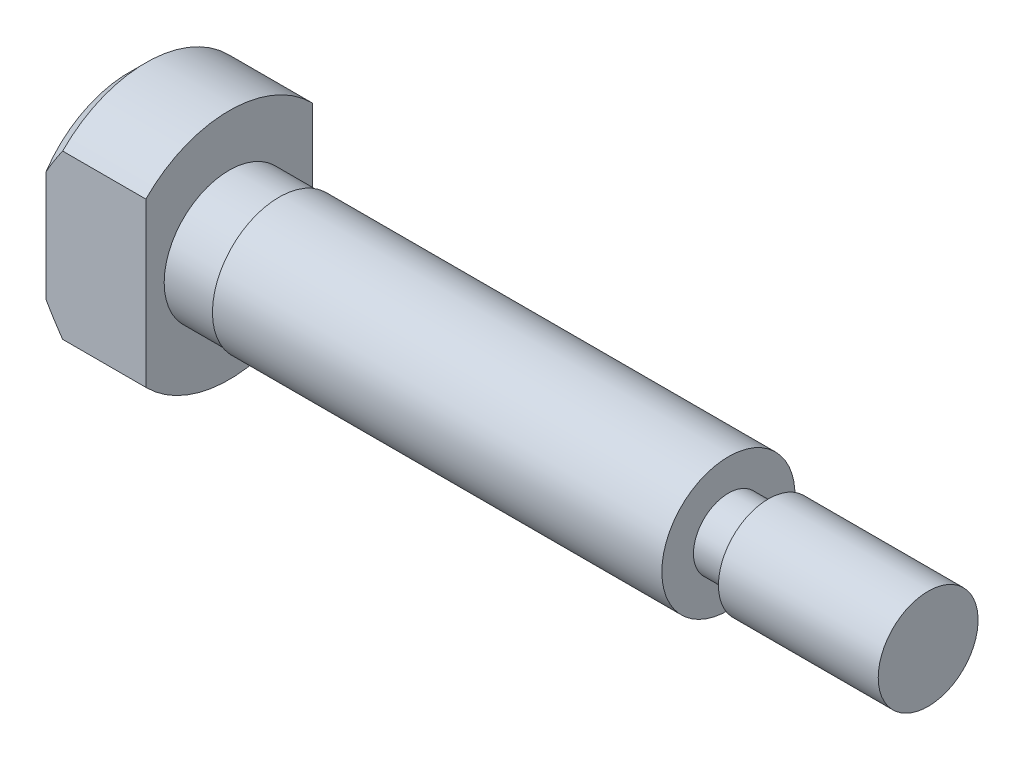
ISO-10303-21;
HEADER;
FILE_DESCRIPTION(('STEP AP214'),'2;1');
FILE_NAME('part.step','',(''),(''),'','','');
FILE_SCHEMA(('AUTOMOTIVE_DESIGN { 1 0 10303 214 1 1 1 1 }'));
ENDSEC;
DATA;
#1=APPLICATION_CONTEXT('core data for automotive mechanical design processes');
#2=APPLICATION_PROTOCOL_DEFINITION('international standard','automotive_design',2000,#1);
#3=PRODUCT_CONTEXT('',#1,'mechanical');
#4=PRODUCT('Part','Part','',(#3));
#5=PRODUCT_RELATED_PRODUCT_CATEGORY('part','',(#4));
#6=PRODUCT_DEFINITION_FORMATION('','',#4);
#7=PRODUCT_DEFINITION_CONTEXT('part definition',#1,'design');
#8=PRODUCT_DEFINITION('design','',#6,#7);
#9=PRODUCT_DEFINITION_SHAPE('','',#8);
#10=(LENGTH_UNIT() NAMED_UNIT(*) SI_UNIT(.MILLI.,.METRE.));
#11=(NAMED_UNIT(*) PLANE_ANGLE_UNIT() SI_UNIT($,.RADIAN.));
#12=(NAMED_UNIT(*) SI_UNIT($,.STERADIAN.) SOLID_ANGLE_UNIT());
#13=UNCERTAINTY_MEASURE_WITH_UNIT(LENGTH_MEASURE(1.E-05),#10,'distance_accuracy_value','');
#14=(GEOMETRIC_REPRESENTATION_CONTEXT(3) GLOBAL_UNCERTAINTY_ASSIGNED_CONTEXT((#13)) GLOBAL_UNIT_ASSIGNED_CONTEXT((#10,
#11,#12)) REPRESENTATION_CONTEXT('',''));
#15=CARTESIAN_POINT('',(0.,0.,0.));
#16=DIRECTION('',(0.,0.,1.));
#17=DIRECTION('',(1.,0.,0.));
#18=AXIS2_PLACEMENT_3D('',#15,#16,#17);
#19=CARTESIAN_POINT('',(0.,0.,0.));
#20=DIRECTION('',(-1.,0.,0.));
#21=DIRECTION('',(0.,0.,1.));
#22=AXIS2_PLACEMENT_3D('',#19,#20,#21);
#23=CYLINDRICAL_SURFACE('',#22,3.5);
#24=DIRECTION('',(-1.,0.,0.));
#25=VECTOR('',#24,1.);
#26=CARTESIAN_POINT('',(0.,2.44948974278318,-2.5));
#27=LINE('',#26,#25);
#28=CARTESIAN_POINT('',(0.,2.44948974278318,-2.5));
#29=VERTEX_POINT('',#28);
#30=CARTESIAN_POINT('',(-2.5,2.44948974278318,-2.5));
#31=VERTEX_POINT('',#30);
#32=EDGE_CURVE('E297',#29,#31,#27,.T.);
#33=ORIENTED_EDGE('',*,*,#32,.T.);
#34=CARTESIAN_POINT('',(-2.5,0.,0.));
#35=DIRECTION('',(1.,0.,0.));
#36=DIRECTION('',(0.,0.,-1.));
#37=AXIS2_PLACEMENT_3D('',#34,#35,#36);
#38=CIRCLE('',#37,3.5);
#39=CARTESIAN_POINT('',(-2.5,2.44948974278318,2.5));
#40=VERTEX_POINT('',#39);
#41=EDGE_CURVE('E11',#31,#40,#38,.T.);
#42=ORIENTED_EDGE('',*,*,#41,.T.);
#43=DIRECTION('',(-1.,0.,0.));
#44=VECTOR('',#43,1.);
#45=CARTESIAN_POINT('',(0.,2.44948974278318,2.5));
#46=LINE('',#45,#44);
#47=CARTESIAN_POINT('',(0.,2.44948974278318,2.5));
#48=VERTEX_POINT('',#47);
#49=EDGE_CURVE('E89',#40,#48,#46,.F.);
#50=ORIENTED_EDGE('',*,*,#49,.T.);
#51=CARTESIAN_POINT('',(0.,0.,0.));
#52=DIRECTION('',(-1.,0.,0.));
#53=DIRECTION('',(0.,0.,1.));
#54=AXIS2_PLACEMENT_3D('',#51,#52,#53);
#55=CIRCLE('',#54,3.5);
#56=EDGE_CURVE('E92',#48,#29,#55,.T.);
#57=ORIENTED_EDGE('',*,*,#56,.T.);
#58=EDGE_LOOP('',(#33,#42,#50,#57));
#59=FACE_BOUND('',#58,.T.);
#60=ADVANCED_FACE('F35',(#59),#23,.T.);
#61=CARTESIAN_POINT('',(-3.,0.,0.));
#62=DIRECTION('',(1.,0.,0.));
#63=DIRECTION('',(0.,0.,-1.));
#64=AXIS2_PLACEMENT_3D('',#61,#62,#63);
#65=PLANE('',#64);
#66=DIRECTION('',(0.,1.,0.));
#67=VECTOR('',#66,1.);
#68=CARTESIAN_POINT('',(-3.,-3.5,-2.5));
#69=LINE('',#68,#67);
#70=CARTESIAN_POINT('',(-3.,-1.65831239517771,-2.5));
#71=VERTEX_POINT('',#70);
#72=CARTESIAN_POINT('',(-3.,1.65831239517771,-2.5));
#73=VERTEX_POINT('',#72);
#74=EDGE_CURVE('E293',#71,#73,#69,.T.);
#75=ORIENTED_EDGE('',*,*,#74,.F.);
#76=CARTESIAN_POINT('',(-3.,0.,0.));
#77=DIRECTION('',(1.,0.,0.));
#78=DIRECTION('',(0.,0.,-1.));
#79=AXIS2_PLACEMENT_3D('',#76,#77,#78);
#80=CIRCLE('',#79,3.);
#81=CARTESIAN_POINT('',(-3.,-1.6583123951777,2.5));
#82=VERTEX_POINT('',#81);
#83=EDGE_CURVE('E124',#71,#82,#80,.F.);
#84=ORIENTED_EDGE('',*,*,#83,.T.);
#85=DIRECTION('',(0.,1.,0.));
#86=VECTOR('',#85,1.);
#87=CARTESIAN_POINT('',(-3.,-3.5,2.5));
#88=LINE('',#87,#86);
#89=CARTESIAN_POINT('',(-3.,1.6583123951777,2.5));
#90=VERTEX_POINT('',#89);
#91=EDGE_CURVE('E97',#82,#90,#88,.T.);
#92=ORIENTED_EDGE('',*,*,#91,.T.);
#93=CARTESIAN_POINT('',(-3.,0.,0.));
#94=DIRECTION('',(1.,0.,0.));
#95=DIRECTION('',(0.,0.,-1.));
#96=AXIS2_PLACEMENT_3D('',#93,#94,#95);
#97=CIRCLE('',#96,3.);
#98=EDGE_CURVE('E106',#90,#73,#97,.F.);
#99=ORIENTED_EDGE('',*,*,#98,.T.);
#100=EDGE_LOOP('',(#75,#84,#92,#99));
#101=FACE_BOUND('',#100,.T.);
#102=ADVANCED_FACE('F161',(#101),#65,.F.);
#103=DIRECTION('',(-1.,0.,0.));
#104=VECTOR('',#103,1.);
#105=CARTESIAN_POINT('',(0.,-2.44948974278318,2.5));
#106=LINE('',#105,#104);
#107=CARTESIAN_POINT('',(0.,-2.44948974278318,2.5));
#108=VERTEX_POINT('',#107);
#109=CARTESIAN_POINT('',(-2.5,-2.44948974278318,2.5));
#110=VERTEX_POINT('',#109);
#111=EDGE_CURVE('E96',#108,#110,#106,.T.);
#112=ORIENTED_EDGE('',*,*,#111,.T.);
#113=CARTESIAN_POINT('',(-2.5,0.,0.));
#114=DIRECTION('',(1.,0.,0.));
#115=DIRECTION('',(0.,0.,-1.));
#116=AXIS2_PLACEMENT_3D('',#113,#114,#115);
#117=CIRCLE('',#116,3.5);
#118=CARTESIAN_POINT('',(-2.5,-2.44948974278318,-2.5));
#119=VERTEX_POINT('',#118);
#120=EDGE_CURVE('E59',#110,#119,#117,.T.);
#121=ORIENTED_EDGE('',*,*,#120,.T.);
#122=DIRECTION('',(-1.,0.,0.));
#123=VECTOR('',#122,1.);
#124=CARTESIAN_POINT('',(0.,-2.44948974278318,-2.5));
#125=LINE('',#124,#123);
#126=CARTESIAN_POINT('',(0.,-2.44948974278318,-2.5));
#127=VERTEX_POINT('',#126);
#128=EDGE_CURVE('E295',#119,#127,#125,.F.);
#129=ORIENTED_EDGE('',*,*,#128,.T.);
#130=EDGE_CURVE('E113',#127,#108,#55,.T.);
#131=ORIENTED_EDGE('',*,*,#130,.T.);
#132=EDGE_LOOP('',(#112,#121,#129,#131));
#133=FACE_BOUND('',#132,.T.);
#134=ADVANCED_FACE('F165',(#133),#23,.T.);
#135=CARTESIAN_POINT('',(0.,3.5,0.));
#136=DIRECTION('',(-1.,0.,0.));
#137=DIRECTION('',(0.,0.,1.));
#138=AXIS2_PLACEMENT_3D('',#135,#136,#137);
#139=PLANE('',#138);
#140=ORIENTED_EDGE('',*,*,#56,.F.);
#141=DIRECTION('',(0.,-1.,0.));
#142=VECTOR('',#141,1.);
#143=CARTESIAN_POINT('',(0.,3.5,2.5));
#144=LINE('',#143,#142);
#145=EDGE_CURVE('E100',#48,#108,#144,.T.);
#146=ORIENTED_EDGE('',*,*,#145,.T.);
#147=ORIENTED_EDGE('',*,*,#130,.F.);
#148=DIRECTION('',(0.,1.,0.));
#149=VECTOR('',#148,1.);
#150=CARTESIAN_POINT('',(0.,3.5,-2.5));
#151=LINE('',#150,#149);
#152=EDGE_CURVE('E107',#127,#29,#151,.T.);
#153=ORIENTED_EDGE('',*,*,#152,.T.);
#154=EDGE_LOOP('',(#140,#146,#147,#153));
#155=FACE_BOUND('',#154,.T.);
#156=CARTESIAN_POINT('',(0.,0.,0.));
#157=DIRECTION('',(-1.,0.,0.));
#158=DIRECTION('',(0.,0.,1.));
#159=AXIS2_PLACEMENT_3D('',#156,#157,#158);
#160=CIRCLE('',#159,1.95);
#161=CARTESIAN_POINT('',(0.,0.,1.95));
#162=VERTEX_POINT('',#161);
#163=EDGE_CURVE('E114',#162,#162,#160,.T.);
#164=ORIENTED_EDGE('',*,*,#163,.T.);
#165=EDGE_LOOP('',(#164));
#166=FACE_BOUND('',#165,.T.);
#167=ADVANCED_FACE('F110',(#155,#166),#139,.F.);
#168=CARTESIAN_POINT('',(0.,0.,0.));
#169=DIRECTION('',(-1.,0.,0.));
#170=DIRECTION('',(0.,0.,1.));
#171=AXIS2_PLACEMENT_3D('',#168,#169,#170);
#172=CYLINDRICAL_SURFACE('',#171,1.95);
#173=ORIENTED_EDGE('',*,*,#163,.F.);
#174=EDGE_LOOP('',(#173));
#175=FACE_BOUND('',#174,.T.);
#176=CARTESIAN_POINT('',(1.5,0.,0.));
#177=DIRECTION('',(-1.,0.,0.));
#178=DIRECTION('',(0.,0.,1.));
#179=AXIS2_PLACEMENT_3D('',#176,#177,#178);
#180=CIRCLE('',#179,1.95);
#181=CARTESIAN_POINT('',(1.5,0.,1.95));
#182=VERTEX_POINT('',#181);
#183=EDGE_CURVE('E117',#182,#182,#180,.T.);
#184=ORIENTED_EDGE('',*,*,#183,.T.);
#185=EDGE_LOOP('',(#184));
#186=FACE_BOUND('',#185,.T.);
#187=ADVANCED_FACE('F171',(#175,#186),#172,.T.);
#188=CARTESIAN_POINT('',(1.5,1.95,0.));
#189=DIRECTION('',(1.,0.,0.));
#190=DIRECTION('',(0.,0.,-1.));
#191=AXIS2_PLACEMENT_3D('',#188,#189,#190);
#192=PLANE('',#191);
#193=ORIENTED_EDGE('',*,*,#183,.F.);
#194=EDGE_LOOP('',(#193));
#195=FACE_BOUND('',#194,.T.);
#196=CARTESIAN_POINT('',(1.5,0.,0.));
#197=DIRECTION('',(-1.,0.,0.));
#198=DIRECTION('',(0.,0.,1.));
#199=AXIS2_PLACEMENT_3D('',#196,#197,#198);
#200=CIRCLE('',#199,2.);
#201=CARTESIAN_POINT('',(1.5,0.,2.));
#202=VERTEX_POINT('',#201);
#203=EDGE_CURVE('E314',#202,#202,#200,.T.);
#204=ORIENTED_EDGE('',*,*,#203,.T.);
#205=EDGE_LOOP('',(#204));
#206=FACE_BOUND('',#205,.T.);
#207=ADVANCED_FACE('F174',(#195,#206),#192,.F.);
#208=CARTESIAN_POINT('',(0.,0.,0.));
#209=DIRECTION('',(-1.,0.,0.));
#210=DIRECTION('',(0.,0.,1.));
#211=AXIS2_PLACEMENT_3D('',#208,#209,#210);
#212=CYLINDRICAL_SURFACE('',#211,2.);
#213=ORIENTED_EDGE('',*,*,#203,.F.);
#214=EDGE_LOOP('',(#213));
#215=FACE_BOUND('',#214,.T.);
#216=CARTESIAN_POINT('',(15.,0.,0.));
#217=DIRECTION('',(-1.,0.,0.));
#218=DIRECTION('',(0.,0.,1.));
#219=AXIS2_PLACEMENT_3D('',#216,#217,#218);
#220=CIRCLE('',#219,2.);
#221=CARTESIAN_POINT('',(15.,0.,2.));
#222=VERTEX_POINT('',#221);
#223=EDGE_CURVE('E311',#222,#222,#220,.T.);
#224=ORIENTED_EDGE('',*,*,#223,.T.);
#225=EDGE_LOOP('',(#224));
#226=FACE_BOUND('',#225,.T.);
#227=ADVANCED_FACE('F178',(#215,#226),#212,.T.);
#228=CARTESIAN_POINT('',(15.,2.,0.));
#229=DIRECTION('',(-1.,0.,0.));
#230=DIRECTION('',(0.,0.,1.));
#231=AXIS2_PLACEMENT_3D('',#228,#229,#230);
#232=PLANE('',#231);
#233=ORIENTED_EDGE('',*,*,#223,.F.);
#234=EDGE_LOOP('',(#233));
#235=FACE_BOUND('',#234,.T.);
#236=CARTESIAN_POINT('',(15.,0.,0.));
#237=DIRECTION('',(-1.,0.,0.));
#238=DIRECTION('',(0.,0.,1.));
#239=AXIS2_PLACEMENT_3D('',#236,#237,#238);
#240=CIRCLE('',#239,1.05);
#241=CARTESIAN_POINT('',(15.,0.,1.05));
#242=VERTEX_POINT('',#241);
#243=EDGE_CURVE('E308',#242,#242,#240,.T.);
#244=ORIENTED_EDGE('',*,*,#243,.T.);
#245=EDGE_LOOP('',(#244));
#246=FACE_BOUND('',#245,.T.);
#247=ADVANCED_FACE('F182',(#235,#246),#232,.F.);
#248=CARTESIAN_POINT('',(0.,0.,0.));
#249=DIRECTION('',(-1.,0.,0.));
#250=DIRECTION('',(0.,0.,1.));
#251=AXIS2_PLACEMENT_3D('',#248,#249,#250);
#252=CYLINDRICAL_SURFACE('',#251,1.05);
#253=ORIENTED_EDGE('',*,*,#243,.F.);
#254=EDGE_LOOP('',(#253));
#255=FACE_BOUND('',#254,.T.);
#256=CARTESIAN_POINT('',(16.2,0.,0.));
#257=DIRECTION('',(-1.,0.,0.));
#258=DIRECTION('',(0.,0.,1.));
#259=AXIS2_PLACEMENT_3D('',#256,#257,#258);
#260=CIRCLE('',#259,1.05);
#261=CARTESIAN_POINT('',(16.2,0.,1.05));
#262=VERTEX_POINT('',#261);
#263=EDGE_CURVE('E305',#262,#262,#260,.T.);
#264=ORIENTED_EDGE('',*,*,#263,.T.);
#265=EDGE_LOOP('',(#264));
#266=FACE_BOUND('',#265,.T.);
#267=ADVANCED_FACE('F186',(#255,#266),#252,.T.);
#268=CARTESIAN_POINT('',(16.2,1.05,0.));
#269=DIRECTION('',(1.,0.,0.));
#270=DIRECTION('',(0.,0.,-1.));
#271=AXIS2_PLACEMENT_3D('',#268,#269,#270);
#272=PLANE('',#271);
#273=ORIENTED_EDGE('',*,*,#263,.F.);
#274=EDGE_LOOP('',(#273));
#275=FACE_BOUND('',#274,.T.);
#276=CARTESIAN_POINT('',(16.2,0.,0.));
#277=DIRECTION('',(-1.,0.,0.));
#278=DIRECTION('',(0.,0.,1.));
#279=AXIS2_PLACEMENT_3D('',#276,#277,#278);
#280=CIRCLE('',#279,1.5);
#281=CARTESIAN_POINT('',(16.2,0.,1.5));
#282=VERTEX_POINT('',#281);
#283=EDGE_CURVE('E302',#282,#282,#280,.T.);
#284=ORIENTED_EDGE('',*,*,#283,.T.);
#285=EDGE_LOOP('',(#284));
#286=FACE_BOUND('',#285,.T.);
#287=ADVANCED_FACE('F190',(#275,#286),#272,.F.);
#288=CARTESIAN_POINT('',(0.,0.,0.));
#289=DIRECTION('',(-1.,0.,0.));
#290=DIRECTION('',(0.,0.,1.));
#291=AXIS2_PLACEMENT_3D('',#288,#289,#290);
#292=CYLINDRICAL_SURFACE('',#291,1.5);
#293=ORIENTED_EDGE('',*,*,#283,.F.);
#294=EDGE_LOOP('',(#293));
#295=FACE_BOUND('',#294,.T.);
#296=CARTESIAN_POINT('',(21.,0.,0.));
#297=DIRECTION('',(-1.,0.,0.));
#298=DIRECTION('',(0.,0.,1.));
#299=AXIS2_PLACEMENT_3D('',#296,#297,#298);
#300=CIRCLE('',#299,1.5);
#301=CARTESIAN_POINT('',(21.,0.,1.5));
#302=VERTEX_POINT('',#301);
#303=EDGE_CURVE('E299',#302,#302,#300,.T.);
#304=ORIENTED_EDGE('',*,*,#303,.T.);
#305=EDGE_LOOP('',(#304));
#306=FACE_BOUND('',#305,.T.);
#307=ADVANCED_FACE('F193',(#295,#306),#292,.T.);
#308=CARTESIAN_POINT('',(21.,1.5,0.));
#309=DIRECTION('',(-1.,0.,0.));
#310=DIRECTION('',(0.,0.,1.));
#311=AXIS2_PLACEMENT_3D('',#308,#309,#310);
#312=PLANE('',#311);
#313=ORIENTED_EDGE('',*,*,#303,.F.);
#314=EDGE_LOOP('',(#313));
#315=FACE_BOUND('',#314,.T.);
#316=ADVANCED_FACE('F147',(#315),#312,.F.);
#317=CARTESIAN_POINT('',(-3.,-3.5,-2.5));
#318=DIRECTION('',(0.,0.,1.));
#319=DIRECTION('',(1.,0.,0.));
#320=AXIS2_PLACEMENT_3D('',#317,#318,#319);
#321=PLANE('',#320);
#322=ORIENTED_EDGE('',*,*,#128,.F.);
#323=CARTESIAN_POINT('',(-2.5,-2.44948974278318,-2.5));
#324=CARTESIAN_POINT('',(-2.54474347372918,-2.38554251126744,-2.5));
#325=CARTESIAN_POINT('',(-2.58890378473383,-2.32118009299519,-2.5));
#326=CARTESIAN_POINT('',(-2.67576585629116,-2.19154358813011,-2.5));
#327=CARTESIAN_POINT('',(-2.71846859510399,-2.12627015614058,-2.5));
#328=CARTESIAN_POINT('',(-2.80219208094932,-1.99463242410214,-2.5));
#329=CARTESIAN_POINT('',(-2.84321255461817,-1.92826794919685,-2.5));
#330=CARTESIAN_POINT('',(-2.92322674351779,-1.79426868492111,-2.5));
#331=CARTESIAN_POINT('',(-2.96221904765526,-1.72663305453461,-2.5));
#332=CARTESIAN_POINT('',(-3.,-1.65831239517771,-2.5));
#333=B_SPLINE_CURVE_WITH_KNOTS('',3,(#323,#324,#325,#326,#327,#328,#329,#330,#331,#332),
.UNSPECIFIED.,.F.,.F.,(4,2,2,2,4),(0.,0.234143987034238,0.468127606501734,0.702149098240006,
0.936331289706138),.UNSPECIFIED.);
#334=EDGE_CURVE('E44',#119,#71,#333,.T.);
#335=ORIENTED_EDGE('',*,*,#334,.T.);
#336=ORIENTED_EDGE('',*,*,#74,.T.);
#337=CARTESIAN_POINT('',(-3.,1.65831239517771,-2.5));
#338=CARTESIAN_POINT('',(-2.96221904765526,1.72663305453461,-2.5));
#339=CARTESIAN_POINT('',(-2.92322674351779,1.79426868492111,-2.5));
#340=CARTESIAN_POINT('',(-2.84321255461817,1.92826794919685,-2.5));
#341=CARTESIAN_POINT('',(-2.80219208094932,1.99463242410214,-2.5));
#342=CARTESIAN_POINT('',(-2.71846859510399,2.12627015614058,-2.5));
#343=CARTESIAN_POINT('',(-2.67576585629116,2.19154358813011,-2.5));
#344=CARTESIAN_POINT('',(-2.58890378473383,2.32118009299519,-2.5));
#345=CARTESIAN_POINT('',(-2.54474347372918,2.38554251126744,-2.5));
#346=CARTESIAN_POINT('',(-2.5,2.44948974278318,-2.5));
#347=B_SPLINE_CURVE_WITH_KNOTS('',3,(#337,#338,#339,#340,#341,#342,#343,#344,#345,#346),
.UNSPECIFIED.,.F.,.F.,(4,2,2,2,4),(0.,0.234182191466133,0.468203683204405,0.702187302671901,
0.936331289706138),.UNSPECIFIED.);
#348=EDGE_CURVE('E51',#73,#31,#347,.T.);
#349=ORIENTED_EDGE('',*,*,#348,.T.);
#350=ORIENTED_EDGE('',*,*,#32,.F.);
#351=ORIENTED_EDGE('',*,*,#152,.F.);
#352=EDGE_LOOP('',(#322,#335,#336,#349,#350,#351));
#353=FACE_BOUND('',#352,.T.);
#354=ADVANCED_FACE('F142',(#353),#321,.F.);
#355=CARTESIAN_POINT('',(-3.,-3.5,2.5));
#356=DIRECTION('',(0.,0.,-1.));
#357=DIRECTION('',(-1.,0.,0.));
#358=AXIS2_PLACEMENT_3D('',#355,#356,#357);
#359=PLANE('',#358);
#360=ORIENTED_EDGE('',*,*,#91,.F.);
#361=CARTESIAN_POINT('',(-3.,-1.6583123951777,2.5));
#362=CARTESIAN_POINT('',(-2.96221904765526,-1.72663305453461,2.5));
#363=CARTESIAN_POINT('',(-2.92322674351779,-1.79426868492111,2.5));
#364=CARTESIAN_POINT('',(-2.84321255461817,-1.92826794919685,2.5));
#365=CARTESIAN_POINT('',(-2.80219208094932,-1.99463242410214,2.5));
#366=CARTESIAN_POINT('',(-2.71846859510399,-2.12627015614058,2.5));
#367=CARTESIAN_POINT('',(-2.67576585629115,-2.19154358813011,2.5));
#368=CARTESIAN_POINT('',(-2.58890378473383,-2.32118009299519,2.5));
#369=CARTESIAN_POINT('',(-2.54474347372918,-2.38554251126744,2.5));
#370=CARTESIAN_POINT('',(-2.5,-2.44948974278318,2.5));
#371=B_SPLINE_CURVE_WITH_KNOTS('',3,(#361,#362,#363,#364,#365,#366,#367,#368,#369,#370),
.UNSPECIFIED.,.F.,.F.,(4,2,2,2,4),(0.,0.234182191466133,0.468203683204405,0.702187302671902,
0.936331289706139),.UNSPECIFIED.);
#372=EDGE_CURVE('E133',#82,#110,#371,.T.);
#373=ORIENTED_EDGE('',*,*,#372,.T.);
#374=ORIENTED_EDGE('',*,*,#111,.F.);
#375=ORIENTED_EDGE('',*,*,#145,.F.);
#376=ORIENTED_EDGE('',*,*,#49,.F.);
#377=CARTESIAN_POINT('',(-2.5,2.44948974278318,2.5));
#378=CARTESIAN_POINT('',(-2.54474347372918,2.38554251126744,2.5));
#379=CARTESIAN_POINT('',(-2.58890378473383,2.32118009299519,2.5));
#380=CARTESIAN_POINT('',(-2.67576585629115,2.19154358813011,2.5));
#381=CARTESIAN_POINT('',(-2.71846859510399,2.12627015614058,2.5));
#382=CARTESIAN_POINT('',(-2.80219208094932,1.99463242410214,2.5));
#383=CARTESIAN_POINT('',(-2.84321255461817,1.92826794919685,2.5));
#384=CARTESIAN_POINT('',(-2.92322674351779,1.79426868492111,2.5));
#385=CARTESIAN_POINT('',(-2.96221904765526,1.72663305453461,2.5));
#386=CARTESIAN_POINT('',(-3.,1.6583123951777,2.5));
#387=B_SPLINE_CURVE_WITH_KNOTS('',3,(#377,#378,#379,#380,#381,#382,#383,#384,#385,#386),
.UNSPECIFIED.,.F.,.F.,(4,2,2,2,4),(0.,0.234143987034238,0.468127606501735,0.702149098240007,
0.936331289706139),.UNSPECIFIED.);
#388=EDGE_CURVE('E127',#40,#90,#387,.T.);
#389=ORIENTED_EDGE('',*,*,#388,.T.);
#390=EDGE_LOOP('',(#360,#373,#374,#375,#376,#389));
#391=FACE_BOUND('',#390,.T.);
#392=ADVANCED_FACE('F102',(#391),#359,.F.);
#393=CARTESIAN_POINT('',(-3.,0.,0.));
#394=DIRECTION('',(1.,0.,0.));
#395=DIRECTION('',(0.,0.,-1.));
#396=AXIS2_PLACEMENT_3D('',#393,#394,#395);
#397=CONICAL_SURFACE('',#396,3.,0.785398163397447);
#398=ORIENTED_EDGE('',*,*,#334,.F.);
#399=ORIENTED_EDGE('',*,*,#120,.F.);
#400=ORIENTED_EDGE('',*,*,#372,.F.);
#401=ORIENTED_EDGE('',*,*,#83,.F.);
#402=EDGE_LOOP('',(#398,#399,#400,#401));
#403=FACE_BOUND('',#402,.T.);
#404=ADVANCED_FACE('F141',(#403),#397,.T.);
#405=CARTESIAN_POINT('',(-3.,0.,0.));
#406=DIRECTION('',(1.,0.,0.));
#407=DIRECTION('',(0.,0.,-1.));
#408=AXIS2_PLACEMENT_3D('',#405,#406,#407);
#409=CONICAL_SURFACE('',#408,3.,0.785398163397447);
#410=ORIENTED_EDGE('',*,*,#388,.F.);
#411=ORIENTED_EDGE('',*,*,#41,.F.);
#412=ORIENTED_EDGE('',*,*,#348,.F.);
#413=ORIENTED_EDGE('',*,*,#98,.F.);
#414=EDGE_LOOP('',(#410,#411,#412,#413));
#415=FACE_BOUND('',#414,.T.);
#416=ADVANCED_FACE('F37',(#415),#409,.T.);
#417=CLOSED_SHELL('',(#60,#102,#134,#167,#187,#207,#227,#247,#267,#287,#307,#316,#354,#392,#404,#416));
#418=MANIFOLD_SOLID_BREP('B2',#417);
#419=ADVANCED_BREP_SHAPE_REPRESENTATION('',(#18,#418),#14);
#420=SHAPE_DEFINITION_REPRESENTATION(#9,#419);
ENDSEC;
END-ISO-10303-21;
